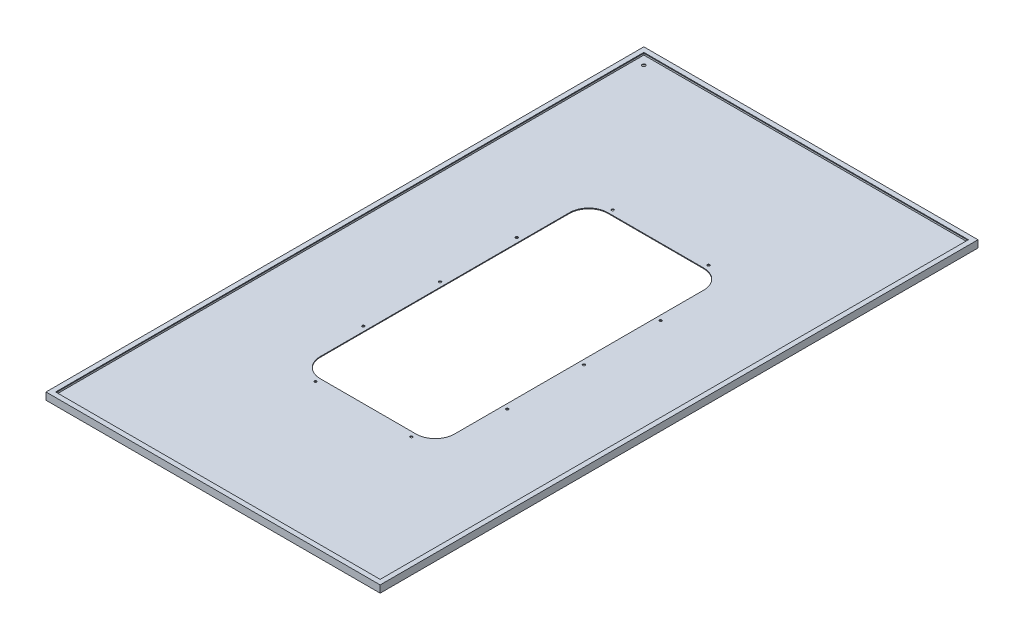
ISO-10303-21;
HEADER;
FILE_DESCRIPTION(('STEP AP214'),'2;1');
FILE_NAME('part.step','',(''),(''),'','','');
FILE_SCHEMA(('AUTOMOTIVE_DESIGN { 1 0 10303 214 1 1 1 1 }'));
ENDSEC;
DATA;
#1=APPLICATION_CONTEXT('core data for automotive mechanical design processes');
#2=APPLICATION_PROTOCOL_DEFINITION('international standard','automotive_design',2000,#1);
#3=PRODUCT_CONTEXT('',#1,'mechanical');
#4=PRODUCT('Part','Part','',(#3));
#5=PRODUCT_RELATED_PRODUCT_CATEGORY('part','',(#4));
#6=PRODUCT_DEFINITION_FORMATION('','',#4);
#7=PRODUCT_DEFINITION_CONTEXT('part definition',#1,'design');
#8=PRODUCT_DEFINITION('design','',#6,#7);
#9=PRODUCT_DEFINITION_SHAPE('','',#8);
#10=(LENGTH_UNIT() NAMED_UNIT(*) SI_UNIT(.MILLI.,.METRE.));
#11=(NAMED_UNIT(*) PLANE_ANGLE_UNIT() SI_UNIT($,.RADIAN.));
#12=(NAMED_UNIT(*) SI_UNIT($,.STERADIAN.) SOLID_ANGLE_UNIT());
#13=UNCERTAINTY_MEASURE_WITH_UNIT(LENGTH_MEASURE(1.E-05),#10,'distance_accuracy_value','');
#14=(GEOMETRIC_REPRESENTATION_CONTEXT(3) GLOBAL_UNCERTAINTY_ASSIGNED_CONTEXT((#13)) GLOBAL_UNIT_ASSIGNED_CONTEXT((#10,
#11,#12)) REPRESENTATION_CONTEXT('',''));
#15=CARTESIAN_POINT('',(0.,0.,0.));
#16=DIRECTION('',(0.,0.,1.));
#17=DIRECTION('',(1.,0.,0.));
#18=AXIS2_PLACEMENT_3D('',#15,#16,#17);
#19=CARTESIAN_POINT('',(-348.5,-485.,701.5));
#20=DIRECTION('',(-1.,0.,0.));
#21=DIRECTION('',(0.,0.,1.));
#22=AXIS2_PLACEMENT_3D('',#19,#20,#21);
#23=PLANE('',#22);
#24=DIRECTION('',(0.,-1.,0.));
#25=VECTOR('',#24,1.);
#26=CARTESIAN_POINT('',(-348.5,-485.,701.5));
#27=LINE('',#26,#25);
#28=CARTESIAN_POINT('',(-348.5,-485.,701.5));
#29=VERTEX_POINT('',#28);
#30=CARTESIAN_POINT('',(-348.5,-500.,701.5));
#31=VERTEX_POINT('',#30);
#32=EDGE_CURVE('E313',#29,#31,#27,.T.);
#33=ORIENTED_EDGE('',*,*,#32,.T.);
#34=DIRECTION('',(0.,0.,-1.));
#35=VECTOR('',#34,1.);
#36=CARTESIAN_POINT('',(-348.5,-500.,701.5));
#37=LINE('',#36,#35);
#38=CARTESIAN_POINT('',(-348.5,-500.,1948.5));
#39=VERTEX_POINT('',#38);
#40=EDGE_CURVE('E299',#39,#31,#37,.T.);
#41=ORIENTED_EDGE('',*,*,#40,.F.);
#42=DIRECTION('',(0.,-1.,0.));
#43=VECTOR('',#42,1.);
#44=CARTESIAN_POINT('',(-348.5,-485.,1948.5));
#45=LINE('',#44,#43);
#46=CARTESIAN_POINT('',(-348.5,-485.,1948.5));
#47=VERTEX_POINT('',#46);
#48=EDGE_CURVE('E25',#47,#39,#45,.T.);
#49=ORIENTED_EDGE('',*,*,#48,.F.);
#50=DIRECTION('',(0.,0.,-1.));
#51=VECTOR('',#50,1.);
#52=CARTESIAN_POINT('',(-348.5,-485.,701.5));
#53=LINE('',#52,#51);
#54=EDGE_CURVE('E300',#47,#29,#53,.T.);
#55=ORIENTED_EDGE('',*,*,#54,.T.);
#56=EDGE_LOOP('',(#33,#41,#49,#55));
#57=FACE_BOUND('',#56,.T.);
#58=ADVANCED_FACE('F17',(#57),#23,.T.);
#59=CARTESIAN_POINT('',(-348.5,-485.,1948.5));
#60=DIRECTION('',(0.,0.,1.));
#61=DIRECTION('',(1.,0.,0.));
#62=AXIS2_PLACEMENT_3D('',#59,#60,#61);
#63=PLANE('',#62);
#64=ORIENTED_EDGE('',*,*,#48,.T.);
#65=DIRECTION('',(-1.,0.,0.));
#66=VECTOR('',#65,1.);
#67=CARTESIAN_POINT('',(-348.5,-500.,1948.5));
#68=LINE('',#67,#66);
#69=CARTESIAN_POINT('',(348.5,-500.,1948.5));
#70=VERTEX_POINT('',#69);
#71=EDGE_CURVE('E304',#70,#39,#68,.T.);
#72=ORIENTED_EDGE('',*,*,#71,.F.);
#73=DIRECTION('',(0.,-1.,0.));
#74=VECTOR('',#73,1.);
#75=CARTESIAN_POINT('',(348.5,-485.,1948.5));
#76=LINE('',#75,#74);
#77=CARTESIAN_POINT('',(348.5,-485.,1948.5));
#78=VERTEX_POINT('',#77);
#79=EDGE_CURVE('E325',#78,#70,#76,.T.);
#80=ORIENTED_EDGE('',*,*,#79,.F.);
#81=DIRECTION('',(-1.,0.,0.));
#82=VECTOR('',#81,1.);
#83=CARTESIAN_POINT('',(-348.5,-485.,1948.5));
#84=LINE('',#83,#82);
#85=EDGE_CURVE('E310',#78,#47,#84,.T.);
#86=ORIENTED_EDGE('',*,*,#85,.T.);
#87=EDGE_LOOP('',(#64,#72,#80,#86));
#88=FACE_BOUND('',#87,.T.);
#89=ADVANCED_FACE('F388',(#88),#63,.T.);
#90=CARTESIAN_POINT('',(348.5,-485.,701.5));
#91=DIRECTION('',(1.,0.,0.));
#92=DIRECTION('',(0.,0.,-1.));
#93=AXIS2_PLACEMENT_3D('',#90,#91,#92);
#94=PLANE('',#93);
#95=ORIENTED_EDGE('',*,*,#79,.T.);
#96=DIRECTION('',(0.,0.,1.));
#97=VECTOR('',#96,1.);
#98=CARTESIAN_POINT('',(348.5,-500.,701.5));
#99=LINE('',#98,#97);
#100=CARTESIAN_POINT('',(348.5,-500.,701.5));
#101=VERTEX_POINT('',#100);
#102=EDGE_CURVE('E319',#101,#70,#99,.T.);
#103=ORIENTED_EDGE('',*,*,#102,.F.);
#104=DIRECTION('',(0.,-1.,0.));
#105=VECTOR('',#104,1.);
#106=CARTESIAN_POINT('',(348.5,-485.,701.5));
#107=LINE('',#106,#105);
#108=CARTESIAN_POINT('',(348.5,-485.,701.5));
#109=VERTEX_POINT('',#108);
#110=EDGE_CURVE('E327',#109,#101,#107,.T.);
#111=ORIENTED_EDGE('',*,*,#110,.F.);
#112=DIRECTION('',(0.,0.,1.));
#113=VECTOR('',#112,1.);
#114=CARTESIAN_POINT('',(348.5,-485.,701.5));
#115=LINE('',#114,#113);
#116=EDGE_CURVE('E307',#109,#78,#115,.T.);
#117=ORIENTED_EDGE('',*,*,#116,.T.);
#118=EDGE_LOOP('',(#95,#103,#111,#117));
#119=FACE_BOUND('',#118,.T.);
#120=ADVANCED_FACE('F393',(#119),#94,.T.);
#121=CARTESIAN_POINT('',(-348.5,-485.,701.5));
#122=DIRECTION('',(0.,0.,-1.));
#123=DIRECTION('',(-1.,0.,0.));
#124=AXIS2_PLACEMENT_3D('',#121,#122,#123);
#125=PLANE('',#124);
#126=ORIENTED_EDGE('',*,*,#110,.T.);
#127=DIRECTION('',(1.,0.,0.));
#128=VECTOR('',#127,1.);
#129=CARTESIAN_POINT('',(-348.5,-500.,701.5));
#130=LINE('',#129,#128);
#131=EDGE_CURVE('E316',#31,#101,#130,.T.);
#132=ORIENTED_EDGE('',*,*,#131,.F.);
#133=ORIENTED_EDGE('',*,*,#32,.F.);
#134=DIRECTION('',(1.,0.,0.));
#135=VECTOR('',#134,1.);
#136=CARTESIAN_POINT('',(-348.5,-485.,701.5));
#137=LINE('',#136,#135);
#138=EDGE_CURVE('E303',#29,#109,#137,.T.);
#139=ORIENTED_EDGE('',*,*,#138,.T.);
#140=EDGE_LOOP('',(#126,#132,#133,#139));
#141=FACE_BOUND('',#140,.T.);
#142=ADVANCED_FACE('F401',(#141),#125,.T.);
#143=CARTESIAN_POINT('',(0.,-485.,0.));
#144=DIRECTION('',(0.,1.,0.));
#145=DIRECTION('',(0.,0.,1.));
#146=AXIS2_PLACEMENT_3D('',#143,#144,#145);
#147=PLANE('',#146);
#148=ORIENTED_EDGE('',*,*,#138,.F.);
#149=ORIENTED_EDGE('',*,*,#54,.F.);
#150=ORIENTED_EDGE('',*,*,#85,.F.);
#151=ORIENTED_EDGE('',*,*,#116,.F.);
#152=EDGE_LOOP('',(#148,#149,#150,#151));
#153=FACE_BOUND('',#152,.T.);
#154=DIRECTION('',(0.,0.,-1.));
#155=VECTOR('',#154,1.);
#156=CARTESIAN_POINT('',(338.5,-485.,1938.5));
#157=LINE('',#156,#155);
#158=CARTESIAN_POINT('',(338.5,-485.,1938.5));
#159=VERTEX_POINT('',#158);
#160=CARTESIAN_POINT('',(338.5,-485.,711.5));
#161=VERTEX_POINT('',#160);
#162=EDGE_CURVE('E252',#159,#161,#157,.T.);
#163=ORIENTED_EDGE('',*,*,#162,.F.);
#164=DIRECTION('',(1.,0.,0.));
#165=VECTOR('',#164,1.);
#166=CARTESIAN_POINT('',(-338.5,-485.,1938.5));
#167=LINE('',#166,#165);
#168=CARTESIAN_POINT('',(-338.5,-485.,1938.5));
#169=VERTEX_POINT('',#168);
#170=EDGE_CURVE('E242',#169,#159,#167,.T.);
#171=ORIENTED_EDGE('',*,*,#170,.F.);
#172=DIRECTION('',(0.,0.,1.));
#173=VECTOR('',#172,1.);
#174=CARTESIAN_POINT('',(-338.5,-485.,711.5));
#175=LINE('',#174,#173);
#176=CARTESIAN_POINT('',(-338.5,-485.,711.5));
#177=VERTEX_POINT('',#176);
#178=EDGE_CURVE('E257',#177,#169,#175,.T.);
#179=ORIENTED_EDGE('',*,*,#178,.F.);
#180=DIRECTION('',(-1.,0.,0.));
#181=VECTOR('',#180,1.);
#182=CARTESIAN_POINT('',(338.5,-485.,711.5));
#183=LINE('',#182,#181);
#184=EDGE_CURVE('E254',#161,#177,#183,.T.);
#185=ORIENTED_EDGE('',*,*,#184,.F.);
#186=EDGE_LOOP('',(#163,#171,#179,#185));
#187=FACE_BOUND('',#186,.T.);
#188=ADVANCED_FACE('F384',(#153,#187),#147,.T.);
#189=CARTESIAN_POINT('',(0.,-500.,0.));
#190=DIRECTION('',(0.,1.,0.));
#191=DIRECTION('',(0.,0.,1.));
#192=AXIS2_PLACEMENT_3D('',#189,#190,#191);
#193=PLANE('',#192);
#194=CARTESIAN_POINT('',(-150.,-500.,1165.));
#195=DIRECTION('',(0.,1.,0.));
#196=DIRECTION('',(0.,0.,1.));
#197=AXIS2_PLACEMENT_3D('',#194,#195,#196);
#198=CIRCLE('',#197,2.49999999999988);
#199=CARTESIAN_POINT('',(-150.,-500.,1167.5));
#200=VERTEX_POINT('',#199);
#201=EDGE_CURVE('E758',#200,#200,#198,.T.);
#202=ORIENTED_EDGE('',*,*,#201,.T.);
#203=EDGE_LOOP('',(#202));
#204=FACE_BOUND('',#203,.T.);
#205=CARTESIAN_POINT('',(-100.,-500.,1015.));
#206=DIRECTION('',(0.,1.,0.));
#207=DIRECTION('',(0.,0.,1.));
#208=AXIS2_PLACEMENT_3D('',#205,#206,#207);
#209=CIRCLE('',#208,2.49999999999988);
#210=CARTESIAN_POINT('',(-100.,-500.,1017.5));
#211=VERTEX_POINT('',#210);
#212=EDGE_CURVE('E759',#211,#211,#209,.T.);
#213=ORIENTED_EDGE('',*,*,#212,.T.);
#214=EDGE_LOOP('',(#213));
#215=FACE_BOUND('',#214,.T.);
#216=CARTESIAN_POINT('',(150.,-500.,1165.));
#217=DIRECTION('',(0.,1.,0.));
#218=DIRECTION('',(0.,0.,1.));
#219=AXIS2_PLACEMENT_3D('',#216,#217,#218);
#220=CIRCLE('',#219,2.49999999999988);
#221=CARTESIAN_POINT('',(150.,-500.,1167.5));
#222=VERTEX_POINT('',#221);
#223=EDGE_CURVE('E762',#222,#222,#220,.T.);
#224=ORIENTED_EDGE('',*,*,#223,.T.);
#225=EDGE_LOOP('',(#224));
#226=FACE_BOUND('',#225,.T.);
#227=CARTESIAN_POINT('',(100.,-500.,1015.));
#228=DIRECTION('',(0.,1.,0.));
#229=DIRECTION('',(0.,0.,1.));
#230=AXIS2_PLACEMENT_3D('',#227,#228,#229);
#231=CIRCLE('',#230,2.49999999999988);
#232=CARTESIAN_POINT('',(100.,-500.,1017.5));
#233=VERTEX_POINT('',#232);
#234=EDGE_CURVE('E767',#233,#233,#231,.T.);
#235=ORIENTED_EDGE('',*,*,#234,.T.);
#236=EDGE_LOOP('',(#235));
#237=FACE_BOUND('',#236,.T.);
#238=CARTESIAN_POINT('',(100.,-500.,1635.));
#239=DIRECTION('',(0.,1.,0.));
#240=DIRECTION('',(0.,0.,1.));
#241=AXIS2_PLACEMENT_3D('',#238,#239,#240);
#242=CIRCLE('',#241,2.49999999999988);
#243=CARTESIAN_POINT('',(100.,-500.,1637.5));
#244=VERTEX_POINT('',#243);
#245=EDGE_CURVE('E770',#244,#244,#242,.T.);
#246=ORIENTED_EDGE('',*,*,#245,.T.);
#247=EDGE_LOOP('',(#246));
#248=FACE_BOUND('',#247,.T.);
#249=CARTESIAN_POINT('',(150.,-500.,1485.));
#250=DIRECTION('',(0.,1.,0.));
#251=DIRECTION('',(0.,0.,1.));
#252=AXIS2_PLACEMENT_3D('',#249,#250,#251);
#253=CIRCLE('',#252,2.49999999999988);
#254=CARTESIAN_POINT('',(150.,-500.,1487.5));
#255=VERTEX_POINT('',#254);
#256=EDGE_CURVE('E773',#255,#255,#253,.T.);
#257=ORIENTED_EDGE('',*,*,#256,.T.);
#258=EDGE_LOOP('',(#257));
#259=FACE_BOUND('',#258,.T.);
#260=CARTESIAN_POINT('',(-100.,-500.,1635.));
#261=DIRECTION('',(0.,1.,0.));
#262=DIRECTION('',(0.,0.,1.));
#263=AXIS2_PLACEMENT_3D('',#260,#261,#262);
#264=CIRCLE('',#263,2.49999999999988);
#265=CARTESIAN_POINT('',(-100.,-500.,1637.5));
#266=VERTEX_POINT('',#265);
#267=EDGE_CURVE('E776',#266,#266,#264,.T.);
#268=ORIENTED_EDGE('',*,*,#267,.T.);
#269=EDGE_LOOP('',(#268));
#270=FACE_BOUND('',#269,.T.);
#271=CARTESIAN_POINT('',(-150.,-500.,1485.));
#272=DIRECTION('',(0.,1.,0.));
#273=DIRECTION('',(0.,0.,1.));
#274=AXIS2_PLACEMENT_3D('',#271,#272,#273);
#275=CIRCLE('',#274,2.49999999999988);
#276=CARTESIAN_POINT('',(-150.,-500.,1487.5));
#277=VERTEX_POINT('',#276);
#278=EDGE_CURVE('E779',#277,#277,#275,.T.);
#279=ORIENTED_EDGE('',*,*,#278,.T.);
#280=EDGE_LOOP('',(#279));
#281=FACE_BOUND('',#280,.T.);
#282=CARTESIAN_POINT('',(150.,-500.,1325.));
#283=DIRECTION('',(0.,1.,0.));
#284=DIRECTION('',(0.,0.,1.));
#285=AXIS2_PLACEMENT_3D('',#282,#283,#284);
#286=CIRCLE('',#285,2.49999999999994);
#287=CARTESIAN_POINT('',(150.,-500.,1327.5));
#288=VERTEX_POINT('',#287);
#289=EDGE_CURVE('E782',#288,#288,#286,.T.);
#290=ORIENTED_EDGE('',*,*,#289,.T.);
#291=EDGE_LOOP('',(#290));
#292=FACE_BOUND('',#291,.T.);
#293=CARTESIAN_POINT('',(-150.,-500.,1325.));
#294=DIRECTION('',(0.,1.,0.));
#295=DIRECTION('',(0.,0.,1.));
#296=AXIS2_PLACEMENT_3D('',#293,#294,#295);
#297=CIRCLE('',#296,2.49999999999994);
#298=CARTESIAN_POINT('',(-150.,-500.,1327.5));
#299=VERTEX_POINT('',#298);
#300=EDGE_CURVE('E785',#299,#299,#297,.T.);
#301=ORIENTED_EDGE('',*,*,#300,.T.);
#302=EDGE_LOOP('',(#301));
#303=FACE_BOUND('',#302,.T.);
#304=DIRECTION('',(1.,0.,0.));
#305=VECTOR('',#304,1.);
#306=CARTESIAN_POINT('',(0.,-500.,1625.));
#307=LINE('',#306,#305);
#308=CARTESIAN_POINT('',(-99.9999999999997,-500.,1625.));
#309=VERTEX_POINT('',#308);
#310=CARTESIAN_POINT('',(99.9999999999998,-500.,1625.));
#311=VERTEX_POINT('',#310);
#312=EDGE_CURVE('E219',#309,#311,#307,.T.);
#313=ORIENTED_EDGE('',*,*,#312,.T.);
#314=CARTESIAN_POINT('',(100.,-500.,1585.));
#315=DIRECTION('',(0.,1.,0.));
#316=DIRECTION('',(0.,0.,1.));
#317=AXIS2_PLACEMENT_3D('',#314,#315,#316);
#318=CIRCLE('',#317,40.);
#319=CARTESIAN_POINT('',(140.,-500.,1585.));
#320=VERTEX_POINT('',#319);
#321=EDGE_CURVE('E222',#311,#320,#318,.T.);
#322=ORIENTED_EDGE('',*,*,#321,.T.);
#323=DIRECTION('',(0.,0.,-1.));
#324=VECTOR('',#323,1.);
#325=CARTESIAN_POINT('',(140.,-500.,0.));
#326=LINE('',#325,#324);
#327=CARTESIAN_POINT('',(140.,-500.,1065.));
#328=VERTEX_POINT('',#327);
#329=EDGE_CURVE('E194',#320,#328,#326,.T.);
#330=ORIENTED_EDGE('',*,*,#329,.T.);
#331=CARTESIAN_POINT('',(100.,-500.,1065.));
#332=DIRECTION('',(0.,1.,0.));
#333=DIRECTION('',(0.,0.,1.));
#334=AXIS2_PLACEMENT_3D('',#331,#332,#333);
#335=CIRCLE('',#334,40.);
#336=CARTESIAN_POINT('',(99.9999999999998,-500.,1025.));
#337=VERTEX_POINT('',#336);
#338=EDGE_CURVE('E161',#328,#337,#335,.T.);
#339=ORIENTED_EDGE('',*,*,#338,.T.);
#340=DIRECTION('',(-1.,0.,0.));
#341=VECTOR('',#340,1.);
#342=CARTESIAN_POINT('',(0.,-500.,1025.));
#343=LINE('',#342,#341);
#344=CARTESIAN_POINT('',(-100.,-500.,1025.));
#345=VERTEX_POINT('',#344);
#346=EDGE_CURVE('E207',#337,#345,#343,.T.);
#347=ORIENTED_EDGE('',*,*,#346,.T.);
#348=CARTESIAN_POINT('',(-100.,-500.,1065.));
#349=DIRECTION('',(0.,1.,0.));
#350=DIRECTION('',(0.,0.,1.));
#351=AXIS2_PLACEMENT_3D('',#348,#349,#350);
#352=CIRCLE('',#351,40.);
#353=CARTESIAN_POINT('',(-140.,-500.,1065.));
#354=VERTEX_POINT('',#353);
#355=EDGE_CURVE('E210',#345,#354,#352,.T.);
#356=ORIENTED_EDGE('',*,*,#355,.T.);
#357=DIRECTION('',(0.,0.,1.));
#358=VECTOR('',#357,1.);
#359=CARTESIAN_POINT('',(-140.,-500.,0.));
#360=LINE('',#359,#358);
#361=CARTESIAN_POINT('',(-140.,-500.,1585.));
#362=VERTEX_POINT('',#361);
#363=EDGE_CURVE('E213',#354,#362,#360,.T.);
#364=ORIENTED_EDGE('',*,*,#363,.T.);
#365=CARTESIAN_POINT('',(-100.,-500.,1585.));
#366=DIRECTION('',(0.,1.,0.));
#367=DIRECTION('',(0.,0.,1.));
#368=AXIS2_PLACEMENT_3D('',#365,#366,#367);
#369=CIRCLE('',#368,40.);
#370=EDGE_CURVE('E216',#362,#309,#369,.T.);
#371=ORIENTED_EDGE('',*,*,#370,.T.);
#372=EDGE_LOOP('',(#313,#322,#330,#339,#347,#356,#364,#371));
#373=FACE_BOUND('',#372,.T.);
#374=CARTESIAN_POINT('',(-328.5,-500.,1928.5));
#375=DIRECTION('',(0.,-1.,0.));
#376=DIRECTION('',(0.,0.,-1.));
#377=AXIS2_PLACEMENT_3D('',#374,#375,#376);
#378=CIRCLE('',#377,3.5);
#379=CARTESIAN_POINT('',(-328.5,-500.,1925.));
#380=VERTEX_POINT('',#379);
#381=EDGE_CURVE('E229',#380,#380,#378,.T.);
#382=ORIENTED_EDGE('',*,*,#381,.F.);
#383=EDGE_LOOP('',(#382));
#384=FACE_BOUND('',#383,.T.);
#385=CARTESIAN_POINT('',(328.5,-500.,721.500000000001));
#386=DIRECTION('',(0.,-1.,0.));
#387=DIRECTION('',(0.,0.,-1.));
#388=AXIS2_PLACEMENT_3D('',#385,#386,#387);
#389=CIRCLE('',#388,3.5);
#390=CARTESIAN_POINT('',(328.5,-500.,718.000000000001));
#391=VERTEX_POINT('',#390);
#392=EDGE_CURVE('E228',#391,#391,#389,.T.);
#393=ORIENTED_EDGE('',*,*,#392,.F.);
#394=EDGE_LOOP('',(#393));
#395=FACE_BOUND('',#394,.T.);
#396=CARTESIAN_POINT('',(328.5,-500.,1928.5));
#397=DIRECTION('',(0.,-1.,0.));
#398=DIRECTION('',(0.,0.,-1.));
#399=AXIS2_PLACEMENT_3D('',#396,#397,#398);
#400=CIRCLE('',#399,3.5);
#401=CARTESIAN_POINT('',(328.5,-500.,1925.));
#402=VERTEX_POINT('',#401);
#403=EDGE_CURVE('E225',#402,#402,#400,.T.);
#404=ORIENTED_EDGE('',*,*,#403,.F.);
#405=EDGE_LOOP('',(#404));
#406=FACE_BOUND('',#405,.T.);
#407=CARTESIAN_POINT('',(-328.5,-500.,721.5));
#408=DIRECTION('',(0.,-1.,0.));
#409=DIRECTION('',(0.,0.,-1.));
#410=AXIS2_PLACEMENT_3D('',#407,#408,#409);
#411=CIRCLE('',#410,3.5);
#412=CARTESIAN_POINT('',(-328.5,-500.,718.));
#413=VERTEX_POINT('',#412);
#414=EDGE_CURVE('E232',#413,#413,#411,.T.);
#415=ORIENTED_EDGE('',*,*,#414,.F.);
#416=EDGE_LOOP('',(#415));
#417=FACE_BOUND('',#416,.T.);
#418=ORIENTED_EDGE('',*,*,#40,.T.);
#419=ORIENTED_EDGE('',*,*,#131,.T.);
#420=ORIENTED_EDGE('',*,*,#102,.T.);
#421=ORIENTED_EDGE('',*,*,#71,.T.);
#422=EDGE_LOOP('',(#418,#419,#420,#421));
#423=FACE_BOUND('',#422,.T.);
#424=ADVANCED_FACE('F373',(#204,#215,#226,#237,#248,#259,#270,#281,#292,#303,#373,#384,#395,
#406,#417,#423),#193,.F.);
#425=CARTESIAN_POINT('',(0.,-486.5,0.));
#426=DIRECTION('',(0.,1.,0.));
#427=DIRECTION('',(0.,0.,1.));
#428=AXIS2_PLACEMENT_3D('',#425,#426,#427);
#429=PLANE('',#428);
#430=DIRECTION('',(1.,0.,0.));
#431=VECTOR('',#430,1.);
#432=CARTESIAN_POINT('',(-338.5,-486.5,1938.5));
#433=LINE('',#432,#431);
#434=CARTESIAN_POINT('',(-338.5,-486.5,1938.5));
#435=VERTEX_POINT('',#434);
#436=CARTESIAN_POINT('',(338.5,-486.5,1938.5));
#437=VERTEX_POINT('',#436);
#438=EDGE_CURVE('E248',#435,#437,#433,.T.);
#439=ORIENTED_EDGE('',*,*,#438,.T.);
#440=DIRECTION('',(0.,0.,-1.));
#441=VECTOR('',#440,1.);
#442=CARTESIAN_POINT('',(338.5,-486.5,1938.5));
#443=LINE('',#442,#441);
#444=CARTESIAN_POINT('',(338.5,-486.5,711.5));
#445=VERTEX_POINT('',#444);
#446=EDGE_CURVE('E238',#437,#445,#443,.T.);
#447=ORIENTED_EDGE('',*,*,#446,.T.);
#448=DIRECTION('',(-1.,0.,0.));
#449=VECTOR('',#448,1.);
#450=CARTESIAN_POINT('',(338.5,-486.5,711.5));
#451=LINE('',#450,#449);
#452=CARTESIAN_POINT('',(-338.5,-486.5,711.5));
#453=VERTEX_POINT('',#452);
#454=EDGE_CURVE('E241',#445,#453,#451,.T.);
#455=ORIENTED_EDGE('',*,*,#454,.T.);
#456=DIRECTION('',(0.,0.,1.));
#457=VECTOR('',#456,1.);
#458=CARTESIAN_POINT('',(-338.5,-486.5,711.5));
#459=LINE('',#458,#457);
#460=EDGE_CURVE('E245',#453,#435,#459,.T.);
#461=ORIENTED_EDGE('',*,*,#460,.T.);
#462=EDGE_LOOP('',(#439,#447,#455,#461));
#463=FACE_BOUND('',#462,.T.);
#464=DIRECTION('',(0.,0.,-1.));
#465=VECTOR('',#464,1.);
#466=CARTESIAN_POINT('',(-347.,-486.5,703.));
#467=LINE('',#466,#465);
#468=CARTESIAN_POINT('',(-347.,-486.5,1947.));
#469=VERTEX_POINT('',#468);
#470=CARTESIAN_POINT('',(-347.,-486.5,703.));
#471=VERTEX_POINT('',#470);
#472=EDGE_CURVE('E11',#469,#471,#467,.T.);
#473=ORIENTED_EDGE('',*,*,#472,.T.);
#474=DIRECTION('',(1.,0.,0.));
#475=VECTOR('',#474,1.);
#476=CARTESIAN_POINT('',(347.,-486.5,703.));
#477=LINE('',#476,#475);
#478=CARTESIAN_POINT('',(347.,-486.5,703.));
#479=VERTEX_POINT('',#478);
#480=EDGE_CURVE('E276',#471,#479,#477,.T.);
#481=ORIENTED_EDGE('',*,*,#480,.T.);
#482=DIRECTION('',(0.,0.,1.));
#483=VECTOR('',#482,1.);
#484=CARTESIAN_POINT('',(347.,-486.5,1947.));
#485=LINE('',#484,#483);
#486=CARTESIAN_POINT('',(347.,-486.5,1947.));
#487=VERTEX_POINT('',#486);
#488=EDGE_CURVE('E273',#479,#487,#485,.T.);
#489=ORIENTED_EDGE('',*,*,#488,.T.);
#490=DIRECTION('',(-1.,0.,0.));
#491=VECTOR('',#490,1.);
#492=CARTESIAN_POINT('',(-347.,-486.5,1947.));
#493=LINE('',#492,#491);
#494=EDGE_CURVE('E264',#487,#469,#493,.T.);
#495=ORIENTED_EDGE('',*,*,#494,.T.);
#496=EDGE_LOOP('',(#473,#481,#489,#495));
#497=FACE_BOUND('',#496,.T.);
#498=ADVANCED_FACE('F370',(#463,#497),#429,.F.);
#499=CARTESIAN_POINT('',(338.5,-486.5,1938.5));
#500=DIRECTION('',(1.,0.,0.));
#501=DIRECTION('',(0.,0.,-1.));
#502=AXIS2_PLACEMENT_3D('',#499,#500,#501);
#503=PLANE('',#502);
#504=ORIENTED_EDGE('',*,*,#162,.T.);
#505=DIRECTION('',(0.,1.,0.));
#506=VECTOR('',#505,1.);
#507=CARTESIAN_POINT('',(338.5,-486.5,711.5));
#508=LINE('',#507,#506);
#509=EDGE_CURVE('E251',#445,#161,#508,.T.);
#510=ORIENTED_EDGE('',*,*,#509,.F.);
#511=ORIENTED_EDGE('',*,*,#446,.F.);
#512=DIRECTION('',(0.,1.,0.));
#513=VECTOR('',#512,1.);
#514=CARTESIAN_POINT('',(338.5,-486.5,1938.5));
#515=LINE('',#514,#513);
#516=EDGE_CURVE('E262',#437,#159,#515,.T.);
#517=ORIENTED_EDGE('',*,*,#516,.T.);
#518=EDGE_LOOP('',(#504,#510,#511,#517));
#519=FACE_BOUND('',#518,.T.);
#520=ADVANCED_FACE('F372',(#519),#503,.F.);
#521=CARTESIAN_POINT('',(-338.5,-486.5,1938.5));
#522=DIRECTION('',(0.,0.,1.));
#523=DIRECTION('',(1.,0.,0.));
#524=AXIS2_PLACEMENT_3D('',#521,#522,#523);
#525=PLANE('',#524);
#526=ORIENTED_EDGE('',*,*,#170,.T.);
#527=ORIENTED_EDGE('',*,*,#516,.F.);
#528=ORIENTED_EDGE('',*,*,#438,.F.);
#529=DIRECTION('',(0.,1.,0.));
#530=VECTOR('',#529,1.);
#531=CARTESIAN_POINT('',(-338.5,-486.5,1938.5));
#532=LINE('',#531,#530);
#533=EDGE_CURVE('E265',#435,#169,#532,.T.);
#534=ORIENTED_EDGE('',*,*,#533,.T.);
#535=EDGE_LOOP('',(#526,#527,#528,#534));
#536=FACE_BOUND('',#535,.T.);
#537=ADVANCED_FACE('F381',(#536),#525,.F.);
#538=CARTESIAN_POINT('',(-338.5,-486.5,711.5));
#539=DIRECTION('',(-1.,0.,0.));
#540=DIRECTION('',(0.,0.,1.));
#541=AXIS2_PLACEMENT_3D('',#538,#539,#540);
#542=PLANE('',#541);
#543=ORIENTED_EDGE('',*,*,#178,.T.);
#544=ORIENTED_EDGE('',*,*,#533,.F.);
#545=ORIENTED_EDGE('',*,*,#460,.F.);
#546=DIRECTION('',(0.,1.,0.));
#547=VECTOR('',#546,1.);
#548=CARTESIAN_POINT('',(-338.5,-486.5,711.5));
#549=LINE('',#548,#547);
#550=EDGE_CURVE('E267',#453,#177,#549,.T.);
#551=ORIENTED_EDGE('',*,*,#550,.T.);
#552=EDGE_LOOP('',(#543,#544,#545,#551));
#553=FACE_BOUND('',#552,.T.);
#554=ADVANCED_FACE('F641',(#553),#542,.F.);
#555=CARTESIAN_POINT('',(338.5,-486.5,711.5));
#556=DIRECTION('',(0.,0.,-1.));
#557=DIRECTION('',(-1.,0.,0.));
#558=AXIS2_PLACEMENT_3D('',#555,#556,#557);
#559=PLANE('',#558);
#560=ORIENTED_EDGE('',*,*,#184,.T.);
#561=ORIENTED_EDGE('',*,*,#550,.F.);
#562=ORIENTED_EDGE('',*,*,#454,.F.);
#563=ORIENTED_EDGE('',*,*,#509,.T.);
#564=EDGE_LOOP('',(#560,#561,#562,#563));
#565=FACE_BOUND('',#564,.T.);
#566=ADVANCED_FACE('F346',(#565),#559,.F.);
#567=CARTESIAN_POINT('',(0.,-498.5,0.));
#568=DIRECTION('',(0.,1.,0.));
#569=DIRECTION('',(0.,0.,1.));
#570=AXIS2_PLACEMENT_3D('',#567,#568,#569);
#571=PLANE('',#570);
#572=CARTESIAN_POINT('',(-150.,-498.5,1165.));
#573=DIRECTION('',(0.,1.,0.));
#574=DIRECTION('',(0.,0.,1.));
#575=AXIS2_PLACEMENT_3D('',#572,#573,#574);
#576=CIRCLE('',#575,2.49999999999988);
#577=CARTESIAN_POINT('',(-150.,-498.5,1167.5));
#578=VERTEX_POINT('',#577);
#579=EDGE_CURVE('E755',#578,#578,#576,.T.);
#580=ORIENTED_EDGE('',*,*,#579,.F.);
#581=EDGE_LOOP('',(#580));
#582=FACE_BOUND('',#581,.T.);
#583=CARTESIAN_POINT('',(-100.,-498.5,1015.));
#584=DIRECTION('',(0.,1.,0.));
#585=DIRECTION('',(0.,0.,1.));
#586=AXIS2_PLACEMENT_3D('',#583,#584,#585);
#587=CIRCLE('',#586,2.49999999999988);
#588=CARTESIAN_POINT('',(-100.,-498.5,1017.5));
#589=VERTEX_POINT('',#588);
#590=EDGE_CURVE('E810',#589,#589,#587,.T.);
#591=ORIENTED_EDGE('',*,*,#590,.F.);
#592=EDGE_LOOP('',(#591));
#593=FACE_BOUND('',#592,.T.);
#594=CARTESIAN_POINT('',(150.,-498.5,1165.));
#595=DIRECTION('',(0.,1.,0.));
#596=DIRECTION('',(0.,0.,-1.));
#597=AXIS2_PLACEMENT_3D('',#594,#595,#596);
#598=CIRCLE('',#597,2.49999999999988);
#599=CARTESIAN_POINT('',(150.,-498.5,1162.5));
#600=VERTEX_POINT('',#599);
#601=EDGE_CURVE('E807',#600,#600,#598,.T.);
#602=ORIENTED_EDGE('',*,*,#601,.F.);
#603=EDGE_LOOP('',(#602));
#604=FACE_BOUND('',#603,.T.);
#605=CARTESIAN_POINT('',(100.,-498.5,1015.));
#606=DIRECTION('',(0.,1.,0.));
#607=DIRECTION('',(0.,0.,-1.));
#608=AXIS2_PLACEMENT_3D('',#605,#606,#607);
#609=CIRCLE('',#608,2.49999999999988);
#610=CARTESIAN_POINT('',(100.,-498.5,1012.5));
#611=VERTEX_POINT('',#610);
#612=EDGE_CURVE('E804',#611,#611,#609,.T.);
#613=ORIENTED_EDGE('',*,*,#612,.F.);
#614=EDGE_LOOP('',(#613));
#615=FACE_BOUND('',#614,.T.);
#616=CARTESIAN_POINT('',(100.,-498.5,1635.));
#617=DIRECTION('',(0.,1.,0.));
#618=DIRECTION('',(0.,0.,1.));
#619=AXIS2_PLACEMENT_3D('',#616,#617,#618);
#620=CIRCLE('',#619,2.49999999999988);
#621=CARTESIAN_POINT('',(100.,-498.5,1637.5));
#622=VERTEX_POINT('',#621);
#623=EDGE_CURVE('E801',#622,#622,#620,.T.);
#624=ORIENTED_EDGE('',*,*,#623,.F.);
#625=EDGE_LOOP('',(#624));
#626=FACE_BOUND('',#625,.T.);
#627=CARTESIAN_POINT('',(150.,-498.5,1485.));
#628=DIRECTION('',(0.,1.,0.));
#629=DIRECTION('',(0.,0.,1.));
#630=AXIS2_PLACEMENT_3D('',#627,#628,#629);
#631=CIRCLE('',#630,2.49999999999988);
#632=CARTESIAN_POINT('',(150.,-498.5,1487.5));
#633=VERTEX_POINT('',#632);
#634=EDGE_CURVE('E798',#633,#633,#631,.T.);
#635=ORIENTED_EDGE('',*,*,#634,.F.);
#636=EDGE_LOOP('',(#635));
#637=FACE_BOUND('',#636,.T.);
#638=CARTESIAN_POINT('',(-100.,-498.5,1635.));
#639=DIRECTION('',(0.,1.,0.));
#640=DIRECTION('',(0.,0.,-1.));
#641=AXIS2_PLACEMENT_3D('',#638,#639,#640);
#642=CIRCLE('',#641,2.49999999999988);
#643=CARTESIAN_POINT('',(-100.,-498.5,1632.5));
#644=VERTEX_POINT('',#643);
#645=EDGE_CURVE('E794',#644,#644,#642,.T.);
#646=ORIENTED_EDGE('',*,*,#645,.F.);
#647=EDGE_LOOP('',(#646));
#648=FACE_BOUND('',#647,.T.);
#649=CARTESIAN_POINT('',(-150.,-498.5,1485.));
#650=DIRECTION('',(0.,1.,0.));
#651=DIRECTION('',(0.,0.,-1.));
#652=AXIS2_PLACEMENT_3D('',#649,#650,#651);
#653=CIRCLE('',#652,2.49999999999988);
#654=CARTESIAN_POINT('',(-150.,-498.5,1482.5));
#655=VERTEX_POINT('',#654);
#656=EDGE_CURVE('E791',#655,#655,#653,.T.);
#657=ORIENTED_EDGE('',*,*,#656,.F.);
#658=EDGE_LOOP('',(#657));
#659=FACE_BOUND('',#658,.T.);
#660=CARTESIAN_POINT('',(150.,-498.5,1325.));
#661=DIRECTION('',(0.,1.,0.));
#662=DIRECTION('',(0.,0.,-1.));
#663=AXIS2_PLACEMENT_3D('',#660,#661,#662);
#664=CIRCLE('',#663,2.49999999999994);
#665=CARTESIAN_POINT('',(150.,-498.5,1322.5));
#666=VERTEX_POINT('',#665);
#667=EDGE_CURVE('E795',#666,#666,#664,.T.);
#668=ORIENTED_EDGE('',*,*,#667,.F.);
#669=EDGE_LOOP('',(#668));
#670=FACE_BOUND('',#669,.T.);
#671=CARTESIAN_POINT('',(-150.,-498.5,1325.));
#672=DIRECTION('',(0.,1.,0.));
#673=DIRECTION('',(0.,0.,1.));
#674=AXIS2_PLACEMENT_3D('',#671,#672,#673);
#675=CIRCLE('',#674,2.49999999999994);
#676=CARTESIAN_POINT('',(-150.,-498.5,1327.5));
#677=VERTEX_POINT('',#676);
#678=EDGE_CURVE('E788',#677,#677,#675,.T.);
#679=ORIENTED_EDGE('',*,*,#678,.F.);
#680=EDGE_LOOP('',(#679));
#681=FACE_BOUND('',#680,.T.);
#682=CARTESIAN_POINT('',(100.,-498.5,1585.));
#683=DIRECTION('',(0.,1.,0.));
#684=DIRECTION('',(0.,0.,1.));
#685=AXIS2_PLACEMENT_3D('',#682,#683,#684);
#686=CIRCLE('',#685,40.);
#687=CARTESIAN_POINT('',(99.9999999999998,-498.5,1625.));
#688=VERTEX_POINT('',#687);
#689=CARTESIAN_POINT('',(140.,-498.5,1585.));
#690=VERTEX_POINT('',#689);
#691=EDGE_CURVE('E41',#688,#690,#686,.T.);
#692=ORIENTED_EDGE('',*,*,#691,.F.);
#693=DIRECTION('',(1.,0.,0.));
#694=VECTOR('',#693,1.);
#695=CARTESIAN_POINT('',(-99.9999999999997,-498.5,1625.));
#696=LINE('',#695,#694);
#697=CARTESIAN_POINT('',(-99.9999999999997,-498.5,1625.));
#698=VERTEX_POINT('',#697);
#699=EDGE_CURVE('E189',#698,#688,#696,.T.);
#700=ORIENTED_EDGE('',*,*,#699,.F.);
#701=CARTESIAN_POINT('',(-100.,-498.5,1585.));
#702=DIRECTION('',(0.,1.,0.));
#703=DIRECTION('',(0.,0.,-1.));
#704=AXIS2_PLACEMENT_3D('',#701,#702,#703);
#705=CIRCLE('',#704,40.);
#706=CARTESIAN_POINT('',(-140.,-498.5,1585.));
#707=VERTEX_POINT('',#706);
#708=EDGE_CURVE('E186',#707,#698,#705,.T.);
#709=ORIENTED_EDGE('',*,*,#708,.F.);
#710=DIRECTION('',(0.,0.,1.));
#711=VECTOR('',#710,1.);
#712=CARTESIAN_POINT('',(-140.,-498.5,1585.));
#713=LINE('',#712,#711);
#714=CARTESIAN_POINT('',(-140.,-498.5,1065.));
#715=VERTEX_POINT('',#714);
#716=EDGE_CURVE('E183',#715,#707,#713,.T.);
#717=ORIENTED_EDGE('',*,*,#716,.F.);
#718=CARTESIAN_POINT('',(-100.,-498.5,1065.));
#719=DIRECTION('',(0.,1.,0.));
#720=DIRECTION('',(0.,0.,-1.));
#721=AXIS2_PLACEMENT_3D('',#718,#719,#720);
#722=CIRCLE('',#721,40.);
#723=CARTESIAN_POINT('',(-100.,-498.5,1025.));
#724=VERTEX_POINT('',#723);
#725=EDGE_CURVE('E177',#724,#715,#722,.T.);
#726=ORIENTED_EDGE('',*,*,#725,.F.);
#727=DIRECTION('',(-1.,0.,0.));
#728=VECTOR('',#727,1.);
#729=CARTESIAN_POINT('',(-99.9999999999997,-498.5,1025.));
#730=LINE('',#729,#728);
#731=CARTESIAN_POINT('',(99.9999999999998,-498.5,1025.));
#732=VERTEX_POINT('',#731);
#733=EDGE_CURVE('E175',#732,#724,#730,.T.);
#734=ORIENTED_EDGE('',*,*,#733,.F.);
#735=CARTESIAN_POINT('',(100.,-498.5,1065.));
#736=DIRECTION('',(0.,1.,0.));
#737=DIRECTION('',(0.,0.,-1.));
#738=AXIS2_PLACEMENT_3D('',#735,#736,#737);
#739=CIRCLE('',#738,40.);
#740=CARTESIAN_POINT('',(140.,-498.5,1065.));
#741=VERTEX_POINT('',#740);
#742=EDGE_CURVE('E158',#741,#732,#739,.T.);
#743=ORIENTED_EDGE('',*,*,#742,.F.);
#744=DIRECTION('',(0.,0.,-1.));
#745=VECTOR('',#744,1.);
#746=CARTESIAN_POINT('',(140.,-498.5,1585.));
#747=LINE('',#746,#745);
#748=EDGE_CURVE('E167',#690,#741,#747,.T.);
#749=ORIENTED_EDGE('',*,*,#748,.F.);
#750=EDGE_LOOP('',(#692,#700,#709,#717,#726,#734,#743,#749));
#751=FACE_BOUND('',#750,.T.);
#752=CARTESIAN_POINT('',(-328.5,-498.5,1928.5));
#753=DIRECTION('',(0.,1.,0.));
#754=DIRECTION('',(0.,0.,1.));
#755=AXIS2_PLACEMENT_3D('',#752,#753,#754);
#756=CIRCLE('',#755,3.5);
#757=CARTESIAN_POINT('',(-328.5,-498.5,1932.));
#758=VERTEX_POINT('',#757);
#759=EDGE_CURVE('E20',#758,#758,#756,.T.);
#760=ORIENTED_EDGE('',*,*,#759,.F.);
#761=EDGE_LOOP('',(#760));
#762=FACE_BOUND('',#761,.T.);
#763=CARTESIAN_POINT('',(328.5,-498.5,721.500000000001));
#764=DIRECTION('',(0.,1.,0.));
#765=DIRECTION('',(0.,0.,1.));
#766=AXIS2_PLACEMENT_3D('',#763,#764,#765);
#767=CIRCLE('',#766,3.5);
#768=CARTESIAN_POINT('',(328.5,-498.5,725.000000000001));
#769=VERTEX_POINT('',#768);
#770=EDGE_CURVE('E334',#769,#769,#767,.T.);
#771=ORIENTED_EDGE('',*,*,#770,.F.);
#772=EDGE_LOOP('',(#771));
#773=FACE_BOUND('',#772,.T.);
#774=CARTESIAN_POINT('',(328.5,-498.5,1928.5));
#775=DIRECTION('',(0.,1.,0.));
#776=DIRECTION('',(0.,0.,1.));
#777=AXIS2_PLACEMENT_3D('',#774,#775,#776);
#778=CIRCLE('',#777,3.5);
#779=CARTESIAN_POINT('',(328.5,-498.5,1932.));
#780=VERTEX_POINT('',#779);
#781=EDGE_CURVE('E332',#780,#780,#778,.T.);
#782=ORIENTED_EDGE('',*,*,#781,.F.);
#783=EDGE_LOOP('',(#782));
#784=FACE_BOUND('',#783,.T.);
#785=CARTESIAN_POINT('',(-328.5,-498.5,721.5));
#786=DIRECTION('',(0.,1.,0.));
#787=DIRECTION('',(0.,0.,1.));
#788=AXIS2_PLACEMENT_3D('',#785,#786,#787);
#789=CIRCLE('',#788,3.5);
#790=CARTESIAN_POINT('',(-328.5,-498.5,725.000000000001));
#791=VERTEX_POINT('',#790);
#792=EDGE_CURVE('E237',#791,#791,#789,.T.);
#793=ORIENTED_EDGE('',*,*,#792,.F.);
#794=EDGE_LOOP('',(#793));
#795=FACE_BOUND('',#794,.T.);
#796=DIRECTION('',(0.,0.,1.));
#797=VECTOR('',#796,1.);
#798=CARTESIAN_POINT('',(347.,-498.5,1947.));
#799=LINE('',#798,#797);
#800=CARTESIAN_POINT('',(347.,-498.5,703.));
#801=VERTEX_POINT('',#800);
#802=CARTESIAN_POINT('',(347.,-498.5,1947.));
#803=VERTEX_POINT('',#802);
#804=EDGE_CURVE('E290',#801,#803,#799,.T.);
#805=ORIENTED_EDGE('',*,*,#804,.F.);
#806=DIRECTION('',(1.,0.,0.));
#807=VECTOR('',#806,1.);
#808=CARTESIAN_POINT('',(347.,-498.5,703.));
#809=LINE('',#808,#807);
#810=CARTESIAN_POINT('',(-347.,-498.5,703.));
#811=VERTEX_POINT('',#810);
#812=EDGE_CURVE('E293',#811,#801,#809,.T.);
#813=ORIENTED_EDGE('',*,*,#812,.F.);
#814=DIRECTION('',(0.,0.,-1.));
#815=VECTOR('',#814,1.);
#816=CARTESIAN_POINT('',(-347.,-498.5,703.));
#817=LINE('',#816,#815);
#818=CARTESIAN_POINT('',(-347.,-498.5,1947.));
#819=VERTEX_POINT('',#818);
#820=EDGE_CURVE('E296',#819,#811,#817,.T.);
#821=ORIENTED_EDGE('',*,*,#820,.F.);
#822=DIRECTION('',(-1.,0.,0.));
#823=VECTOR('',#822,1.);
#824=CARTESIAN_POINT('',(-347.,-498.5,1947.));
#825=LINE('',#824,#823);
#826=EDGE_CURVE('E287',#803,#819,#825,.T.);
#827=ORIENTED_EDGE('',*,*,#826,.F.);
#828=EDGE_LOOP('',(#805,#813,#821,#827));
#829=FACE_BOUND('',#828,.T.);
#830=ADVANCED_FACE('F171',(#582,#593,#604,#615,#626,#637,#648,#659,#670,#681,#751,#762,#773,
#784,#795,#829),#571,.T.);
#831=CARTESIAN_POINT('',(-347.,-1924.49008420557,703.));
#832=DIRECTION('',(-1.,0.,0.));
#833=DIRECTION('',(0.,0.,1.));
#834=AXIS2_PLACEMENT_3D('',#831,#832,#833);
#835=PLANE('',#834);
#836=ORIENTED_EDGE('',*,*,#472,.F.);
#837=DIRECTION('',(0.,-1.,0.));
#838=VECTOR('',#837,1.);
#839=CARTESIAN_POINT('',(-347.,943.572014285594,1947.));
#840=LINE('',#839,#838);
#841=EDGE_CURVE('E285',#469,#819,#840,.T.);
#842=ORIENTED_EDGE('',*,*,#841,.T.);
#843=ORIENTED_EDGE('',*,*,#820,.T.);
#844=DIRECTION('',(0.,-1.,0.));
#845=VECTOR('',#844,1.);
#846=CARTESIAN_POINT('',(-347.,943.572014285594,703.));
#847=LINE('',#846,#845);
#848=EDGE_CURVE('E279',#471,#811,#847,.T.);
#849=ORIENTED_EDGE('',*,*,#848,.F.);
#850=EDGE_LOOP('',(#836,#842,#843,#849));
#851=FACE_BOUND('',#850,.T.);
#852=ADVANCED_FACE('F345',(#851),#835,.F.);
#853=CARTESIAN_POINT('',(-347.,-1924.49008420557,1947.));
#854=DIRECTION('',(0.,0.,1.));
#855=DIRECTION('',(0.,-1.,0.));
#856=AXIS2_PLACEMENT_3D('',#853,#854,#855);
#857=PLANE('',#856);
#858=ORIENTED_EDGE('',*,*,#494,.F.);
#859=DIRECTION('',(0.,-1.,0.));
#860=VECTOR('',#859,1.);
#861=CARTESIAN_POINT('',(347.,943.572014285594,1947.));
#862=LINE('',#861,#860);
#863=EDGE_CURVE('E283',#487,#803,#862,.T.);
#864=ORIENTED_EDGE('',*,*,#863,.T.);
#865=ORIENTED_EDGE('',*,*,#826,.T.);
#866=ORIENTED_EDGE('',*,*,#841,.F.);
#867=EDGE_LOOP('',(#858,#864,#865,#866));
#868=FACE_BOUND('',#867,.T.);
#869=ADVANCED_FACE('F367',(#868),#857,.F.);
#870=CARTESIAN_POINT('',(347.,-1924.49008420557,1947.));
#871=DIRECTION('',(1.,0.,0.));
#872=DIRECTION('',(0.,0.,-1.));
#873=AXIS2_PLACEMENT_3D('',#870,#871,#872);
#874=PLANE('',#873);
#875=ORIENTED_EDGE('',*,*,#488,.F.);
#876=DIRECTION('',(0.,-1.,0.));
#877=VECTOR('',#876,1.);
#878=CARTESIAN_POINT('',(347.,943.572014285594,703.));
#879=LINE('',#878,#877);
#880=EDGE_CURVE('E281',#479,#801,#879,.T.);
#881=ORIENTED_EDGE('',*,*,#880,.T.);
#882=ORIENTED_EDGE('',*,*,#804,.T.);
#883=ORIENTED_EDGE('',*,*,#863,.F.);
#884=EDGE_LOOP('',(#875,#881,#882,#883));
#885=FACE_BOUND('',#884,.T.);
#886=ADVANCED_FACE('F368',(#885),#874,.F.);
#887=CARTESIAN_POINT('',(347.,-1924.49008420557,703.));
#888=DIRECTION('',(0.,0.,-1.));
#889=DIRECTION('',(0.,1.,0.));
#890=AXIS2_PLACEMENT_3D('',#887,#888,#889);
#891=PLANE('',#890);
#892=ORIENTED_EDGE('',*,*,#480,.F.);
#893=ORIENTED_EDGE('',*,*,#848,.T.);
#894=ORIENTED_EDGE('',*,*,#812,.T.);
#895=ORIENTED_EDGE('',*,*,#880,.F.);
#896=EDGE_LOOP('',(#892,#893,#894,#895));
#897=FACE_BOUND('',#896,.T.);
#898=ADVANCED_FACE('F363',(#897),#891,.F.);
#899=CARTESIAN_POINT('',(-328.5,500.,721.5));
#900=DIRECTION('',(0.,-1.,0.));
#901=DIRECTION('',(0.,0.,-1.));
#902=AXIS2_PLACEMENT_3D('',#899,#900,#901);
#903=CYLINDRICAL_SURFACE('',#902,3.5);
#904=ORIENTED_EDGE('',*,*,#792,.T.);
#905=EDGE_LOOP('',(#904));
#906=FACE_BOUND('',#905,.T.);
#907=ORIENTED_EDGE('',*,*,#414,.T.);
#908=EDGE_LOOP('',(#907));
#909=FACE_BOUND('',#908,.T.);
#910=ADVANCED_FACE('F420',(#906,#909),#903,.F.);
#911=CARTESIAN_POINT('',(328.5,500.,1928.5));
#912=DIRECTION('',(0.,-1.,0.));
#913=DIRECTION('',(0.,0.,-1.));
#914=AXIS2_PLACEMENT_3D('',#911,#912,#913);
#915=CYLINDRICAL_SURFACE('',#914,3.5);
#916=ORIENTED_EDGE('',*,*,#781,.T.);
#917=EDGE_LOOP('',(#916));
#918=FACE_BOUND('',#917,.T.);
#919=ORIENTED_EDGE('',*,*,#403,.T.);
#920=EDGE_LOOP('',(#919));
#921=FACE_BOUND('',#920,.T.);
#922=ADVANCED_FACE('F444',(#918,#921),#915,.F.);
#923=CARTESIAN_POINT('',(328.5,500.,721.500000000001));
#924=DIRECTION('',(0.,-1.,0.));
#925=DIRECTION('',(0.,0.,-1.));
#926=AXIS2_PLACEMENT_3D('',#923,#924,#925);
#927=CYLINDRICAL_SURFACE('',#926,3.5);
#928=ORIENTED_EDGE('',*,*,#770,.T.);
#929=EDGE_LOOP('',(#928));
#930=FACE_BOUND('',#929,.T.);
#931=ORIENTED_EDGE('',*,*,#392,.T.);
#932=EDGE_LOOP('',(#931));
#933=FACE_BOUND('',#932,.T.);
#934=ADVANCED_FACE('F453',(#930,#933),#927,.F.);
#935=CARTESIAN_POINT('',(-328.5,500.,1928.5));
#936=DIRECTION('',(0.,-1.,0.));
#937=DIRECTION('',(0.,0.,-1.));
#938=AXIS2_PLACEMENT_3D('',#935,#936,#937);
#939=CYLINDRICAL_SURFACE('',#938,3.5);
#940=ORIENTED_EDGE('',*,*,#759,.T.);
#941=EDGE_LOOP('',(#940));
#942=FACE_BOUND('',#941,.T.);
#943=ORIENTED_EDGE('',*,*,#381,.T.);
#944=EDGE_LOOP('',(#943));
#945=FACE_BOUND('',#944,.T.);
#946=ADVANCED_FACE('F341',(#942,#945),#939,.F.);
#947=CARTESIAN_POINT('',(100.,-580.,1585.));
#948=DIRECTION('',(0.,1.,0.));
#949=DIRECTION('',(0.,0.,1.));
#950=AXIS2_PLACEMENT_3D('',#947,#948,#949);
#951=CYLINDRICAL_SURFACE('',#950,40.);
#952=DIRECTION('',(0.,1.,0.));
#953=VECTOR('',#952,1.);
#954=CARTESIAN_POINT('',(99.9999999999998,-580.,1625.));
#955=LINE('',#954,#953);
#956=EDGE_CURVE('E192',#311,#688,#955,.T.);
#957=ORIENTED_EDGE('',*,*,#956,.T.);
#958=ORIENTED_EDGE('',*,*,#691,.T.);
#959=DIRECTION('',(0.,1.,0.));
#960=VECTOR('',#959,1.);
#961=CARTESIAN_POINT('',(140.,-580.,1585.));
#962=LINE('',#961,#960);
#963=EDGE_CURVE('E164',#320,#690,#962,.T.);
#964=ORIENTED_EDGE('',*,*,#963,.F.);
#965=ORIENTED_EDGE('',*,*,#321,.F.);
#966=EDGE_LOOP('',(#957,#958,#964,#965));
#967=FACE_BOUND('',#966,.T.);
#968=ADVANCED_FACE('F469',(#967),#951,.F.);
#969=CARTESIAN_POINT('',(-99.9999999999997,-580.,1625.));
#970=DIRECTION('',(0.,0.,1.));
#971=DIRECTION('',(1.,0.,0.));
#972=AXIS2_PLACEMENT_3D('',#969,#970,#971);
#973=PLANE('',#972);
#974=DIRECTION('',(0.,1.,0.));
#975=VECTOR('',#974,1.);
#976=CARTESIAN_POINT('',(-99.9999999999997,-580.,1625.));
#977=LINE('',#976,#975);
#978=EDGE_CURVE('E195',#309,#698,#977,.T.);
#979=ORIENTED_EDGE('',*,*,#978,.T.);
#980=ORIENTED_EDGE('',*,*,#699,.T.);
#981=ORIENTED_EDGE('',*,*,#956,.F.);
#982=ORIENTED_EDGE('',*,*,#312,.F.);
#983=EDGE_LOOP('',(#979,#980,#981,#982));
#984=FACE_BOUND('',#983,.T.);
#985=ADVANCED_FACE('F477',(#984),#973,.F.);
#986=CARTESIAN_POINT('',(-100.,-580.,1585.));
#987=DIRECTION('',(0.,1.,0.));
#988=DIRECTION('',(0.,0.,1.));
#989=AXIS2_PLACEMENT_3D('',#986,#987,#988);
#990=CYLINDRICAL_SURFACE('',#989,40.);
#991=DIRECTION('',(0.,1.,0.));
#992=VECTOR('',#991,1.);
#993=CARTESIAN_POINT('',(-140.,-580.,1585.));
#994=LINE('',#993,#992);
#995=EDGE_CURVE('E197',#362,#707,#994,.T.);
#996=ORIENTED_EDGE('',*,*,#995,.T.);
#997=ORIENTED_EDGE('',*,*,#708,.T.);
#998=ORIENTED_EDGE('',*,*,#978,.F.);
#999=ORIENTED_EDGE('',*,*,#370,.F.);
#1000=EDGE_LOOP('',(#996,#997,#998,#999));
#1001=FACE_BOUND('',#1000,.T.);
#1002=ADVANCED_FACE('F485',(#1001),#990,.F.);
#1003=CARTESIAN_POINT('',(-140.,-580.,1585.));
#1004=DIRECTION('',(-1.,0.,0.));
#1005=DIRECTION('',(0.,0.,1.));
#1006=AXIS2_PLACEMENT_3D('',#1003,#1004,#1005);
#1007=PLANE('',#1006);
#1008=DIRECTION('',(0.,1.,0.));
#1009=VECTOR('',#1008,1.);
#1010=CARTESIAN_POINT('',(-140.,-580.,1065.));
#1011=LINE('',#1010,#1009);
#1012=EDGE_CURVE('E199',#354,#715,#1011,.T.);
#1013=ORIENTED_EDGE('',*,*,#1012,.T.);
#1014=ORIENTED_EDGE('',*,*,#716,.T.);
#1015=ORIENTED_EDGE('',*,*,#995,.F.);
#1016=ORIENTED_EDGE('',*,*,#363,.F.);
#1017=EDGE_LOOP('',(#1013,#1014,#1015,#1016));
#1018=FACE_BOUND('',#1017,.T.);
#1019=ADVANCED_FACE('F494',(#1018),#1007,.F.);
#1020=CARTESIAN_POINT('',(-100.,-580.,1065.));
#1021=DIRECTION('',(0.,1.,0.));
#1022=DIRECTION('',(0.,0.,1.));
#1023=AXIS2_PLACEMENT_3D('',#1020,#1021,#1022);
#1024=CYLINDRICAL_SURFACE('',#1023,40.);
#1025=DIRECTION('',(0.,1.,0.));
#1026=VECTOR('',#1025,1.);
#1027=CARTESIAN_POINT('',(-100.,-580.,1025.));
#1028=LINE('',#1027,#1026);
#1029=EDGE_CURVE('E201',#345,#724,#1028,.T.);
#1030=ORIENTED_EDGE('',*,*,#1029,.T.);
#1031=ORIENTED_EDGE('',*,*,#725,.T.);
#1032=ORIENTED_EDGE('',*,*,#1012,.F.);
#1033=ORIENTED_EDGE('',*,*,#355,.F.);
#1034=EDGE_LOOP('',(#1030,#1031,#1032,#1033));
#1035=FACE_BOUND('',#1034,.T.);
#1036=ADVANCED_FACE('F503',(#1035),#1024,.F.);
#1037=CARTESIAN_POINT('',(-99.9999999999997,-580.,1025.));
#1038=DIRECTION('',(0.,0.,-1.));
#1039=DIRECTION('',(-1.,0.,0.));
#1040=AXIS2_PLACEMENT_3D('',#1037,#1038,#1039);
#1041=PLANE('',#1040);
#1042=DIRECTION('',(0.,1.,0.));
#1043=VECTOR('',#1042,1.);
#1044=CARTESIAN_POINT('',(99.9999999999998,-580.,1025.));
#1045=LINE('',#1044,#1043);
#1046=EDGE_CURVE('E163',#337,#732,#1045,.T.);
#1047=ORIENTED_EDGE('',*,*,#1046,.T.);
#1048=ORIENTED_EDGE('',*,*,#733,.T.);
#1049=ORIENTED_EDGE('',*,*,#1029,.F.);
#1050=ORIENTED_EDGE('',*,*,#346,.F.);
#1051=EDGE_LOOP('',(#1047,#1048,#1049,#1050));
#1052=FACE_BOUND('',#1051,.T.);
#1053=ADVANCED_FACE('F512',(#1052),#1041,.F.);
#1054=CARTESIAN_POINT('',(100.,-580.,1065.));
#1055=DIRECTION('',(0.,1.,0.));
#1056=DIRECTION('',(0.,0.,1.));
#1057=AXIS2_PLACEMENT_3D('',#1054,#1055,#1056);
#1058=CYLINDRICAL_SURFACE('',#1057,40.);
#1059=DIRECTION('',(0.,1.,0.));
#1060=VECTOR('',#1059,1.);
#1061=CARTESIAN_POINT('',(140.,-580.,1065.));
#1062=LINE('',#1061,#1060);
#1063=EDGE_CURVE('E33',#328,#741,#1062,.T.);
#1064=ORIENTED_EDGE('',*,*,#1063,.T.);
#1065=ORIENTED_EDGE('',*,*,#742,.T.);
#1066=ORIENTED_EDGE('',*,*,#1046,.F.);
#1067=ORIENTED_EDGE('',*,*,#338,.F.);
#1068=EDGE_LOOP('',(#1064,#1065,#1066,#1067));
#1069=FACE_BOUND('',#1068,.T.);
#1070=ADVANCED_FACE('F155',(#1069),#1058,.F.);
#1071=CARTESIAN_POINT('',(140.,-580.,1585.));
#1072=DIRECTION('',(1.,0.,0.));
#1073=DIRECTION('',(0.,0.,-1.));
#1074=AXIS2_PLACEMENT_3D('',#1071,#1072,#1073);
#1075=PLANE('',#1074);
#1076=ORIENTED_EDGE('',*,*,#963,.T.);
#1077=ORIENTED_EDGE('',*,*,#748,.T.);
#1078=ORIENTED_EDGE('',*,*,#1063,.F.);
#1079=ORIENTED_EDGE('',*,*,#329,.F.);
#1080=EDGE_LOOP('',(#1076,#1077,#1078,#1079));
#1081=FACE_BOUND('',#1080,.T.);
#1082=ADVANCED_FACE('F168',(#1081),#1075,.F.);
#1083=CARTESIAN_POINT('',(-150.,-580.,1325.));
#1084=DIRECTION('',(0.,1.,0.));
#1085=DIRECTION('',(0.,0.,1.));
#1086=AXIS2_PLACEMENT_3D('',#1083,#1084,#1085);
#1087=CYLINDRICAL_SURFACE('',#1086,2.49999999999994);
#1088=ORIENTED_EDGE('',*,*,#678,.T.);
#1089=EDGE_LOOP('',(#1088));
#1090=FACE_BOUND('',#1089,.T.);
#1091=ORIENTED_EDGE('',*,*,#300,.F.);
#1092=EDGE_LOOP('',(#1091));
#1093=FACE_BOUND('',#1092,.T.);
#1094=ADVANCED_FACE('F536',(#1090,#1093),#1087,.F.);
#1095=CARTESIAN_POINT('',(150.,-580.,1325.));
#1096=DIRECTION('',(0.,1.,0.));
#1097=DIRECTION('',(0.,0.,1.));
#1098=AXIS2_PLACEMENT_3D('',#1095,#1096,#1097);
#1099=CYLINDRICAL_SURFACE('',#1098,2.49999999999994);
#1100=ORIENTED_EDGE('',*,*,#667,.T.);
#1101=EDGE_LOOP('',(#1100));
#1102=FACE_BOUND('',#1101,.T.);
#1103=ORIENTED_EDGE('',*,*,#289,.F.);
#1104=EDGE_LOOP('',(#1103));
#1105=FACE_BOUND('',#1104,.T.);
#1106=ADVANCED_FACE('F544',(#1102,#1105),#1099,.F.);
#1107=CARTESIAN_POINT('',(-150.,-580.,1485.));
#1108=DIRECTION('',(0.,1.,0.));
#1109=DIRECTION('',(0.,0.,1.));
#1110=AXIS2_PLACEMENT_3D('',#1107,#1108,#1109);
#1111=CYLINDRICAL_SURFACE('',#1110,2.49999999999988);
#1112=ORIENTED_EDGE('',*,*,#656,.T.);
#1113=EDGE_LOOP('',(#1112));
#1114=FACE_BOUND('',#1113,.T.);
#1115=ORIENTED_EDGE('',*,*,#278,.F.);
#1116=EDGE_LOOP('',(#1115));
#1117=FACE_BOUND('',#1116,.T.);
#1118=ADVANCED_FACE('F553',(#1114,#1117),#1111,.F.);
#1119=CARTESIAN_POINT('',(-100.,-580.,1635.));
#1120=DIRECTION('',(0.,1.,0.));
#1121=DIRECTION('',(0.,0.,1.));
#1122=AXIS2_PLACEMENT_3D('',#1119,#1120,#1121);
#1123=CYLINDRICAL_SURFACE('',#1122,2.49999999999988);
#1124=ORIENTED_EDGE('',*,*,#645,.T.);
#1125=EDGE_LOOP('',(#1124));
#1126=FACE_BOUND('',#1125,.T.);
#1127=ORIENTED_EDGE('',*,*,#267,.F.);
#1128=EDGE_LOOP('',(#1127));
#1129=FACE_BOUND('',#1128,.T.);
#1130=ADVANCED_FACE('F562',(#1126,#1129),#1123,.F.);
#1131=CARTESIAN_POINT('',(150.,-580.,1485.));
#1132=DIRECTION('',(0.,1.,0.));
#1133=DIRECTION('',(0.,0.,1.));
#1134=AXIS2_PLACEMENT_3D('',#1131,#1132,#1133);
#1135=CYLINDRICAL_SURFACE('',#1134,2.49999999999988);
#1136=ORIENTED_EDGE('',*,*,#634,.T.);
#1137=EDGE_LOOP('',(#1136));
#1138=FACE_BOUND('',#1137,.T.);
#1139=ORIENTED_EDGE('',*,*,#256,.F.);
#1140=EDGE_LOOP('',(#1139));
#1141=FACE_BOUND('',#1140,.T.);
#1142=ADVANCED_FACE('F571',(#1138,#1141),#1135,.F.);
#1143=CARTESIAN_POINT('',(100.,-580.,1635.));
#1144=DIRECTION('',(0.,1.,0.));
#1145=DIRECTION('',(0.,0.,1.));
#1146=AXIS2_PLACEMENT_3D('',#1143,#1144,#1145);
#1147=CYLINDRICAL_SURFACE('',#1146,2.49999999999988);
#1148=ORIENTED_EDGE('',*,*,#623,.T.);
#1149=EDGE_LOOP('',(#1148));
#1150=FACE_BOUND('',#1149,.T.);
#1151=ORIENTED_EDGE('',*,*,#245,.F.);
#1152=EDGE_LOOP('',(#1151));
#1153=FACE_BOUND('',#1152,.T.);
#1154=ADVANCED_FACE('F580',(#1150,#1153),#1147,.F.);
#1155=CARTESIAN_POINT('',(100.,-580.,1015.));
#1156=DIRECTION('',(0.,1.,0.));
#1157=DIRECTION('',(0.,0.,1.));
#1158=AXIS2_PLACEMENT_3D('',#1155,#1156,#1157);
#1159=CYLINDRICAL_SURFACE('',#1158,2.49999999999988);
#1160=ORIENTED_EDGE('',*,*,#612,.T.);
#1161=EDGE_LOOP('',(#1160));
#1162=FACE_BOUND('',#1161,.T.);
#1163=ORIENTED_EDGE('',*,*,#234,.F.);
#1164=EDGE_LOOP('',(#1163));
#1165=FACE_BOUND('',#1164,.T.);
#1166=ADVANCED_FACE('F589',(#1162,#1165),#1159,.F.);
#1167=CARTESIAN_POINT('',(150.,-580.,1165.));
#1168=DIRECTION('',(0.,1.,0.));
#1169=DIRECTION('',(0.,0.,1.));
#1170=AXIS2_PLACEMENT_3D('',#1167,#1168,#1169);
#1171=CYLINDRICAL_SURFACE('',#1170,2.49999999999988);
#1172=ORIENTED_EDGE('',*,*,#601,.T.);
#1173=EDGE_LOOP('',(#1172));
#1174=FACE_BOUND('',#1173,.T.);
#1175=ORIENTED_EDGE('',*,*,#223,.F.);
#1176=EDGE_LOOP('',(#1175));
#1177=FACE_BOUND('',#1176,.T.);
#1178=ADVANCED_FACE('F598',(#1174,#1177),#1171,.F.);
#1179=CARTESIAN_POINT('',(-100.,-580.,1015.));
#1180=DIRECTION('',(0.,1.,0.));
#1181=DIRECTION('',(0.,0.,1.));
#1182=AXIS2_PLACEMENT_3D('',#1179,#1180,#1181);
#1183=CYLINDRICAL_SURFACE('',#1182,2.49999999999988);
#1184=ORIENTED_EDGE('',*,*,#590,.T.);
#1185=EDGE_LOOP('',(#1184));
#1186=FACE_BOUND('',#1185,.T.);
#1187=ORIENTED_EDGE('',*,*,#212,.F.);
#1188=EDGE_LOOP('',(#1187));
#1189=FACE_BOUND('',#1188,.T.);
#1190=ADVANCED_FACE('F607',(#1186,#1189),#1183,.F.);
#1191=CARTESIAN_POINT('',(-150.,-580.,1165.));
#1192=DIRECTION('',(0.,1.,0.));
#1193=DIRECTION('',(0.,0.,1.));
#1194=AXIS2_PLACEMENT_3D('',#1191,#1192,#1193);
#1195=CYLINDRICAL_SURFACE('',#1194,2.49999999999988);
#1196=ORIENTED_EDGE('',*,*,#579,.T.);
#1197=EDGE_LOOP('',(#1196));
#1198=FACE_BOUND('',#1197,.T.);
#1199=ORIENTED_EDGE('',*,*,#201,.F.);
#1200=EDGE_LOOP('',(#1199));
#1201=FACE_BOUND('',#1200,.T.);
#1202=ADVANCED_FACE('F616',(#1198,#1201),#1195,.F.);
#1203=CLOSED_SHELL('',(#58,#89,#120,#142,#188,#424,#498,#520,#537,#554,#566,#830,#852,#869,#886,
#898,#910,#922,#934,#946,#968,#985,#1002,#1019,#1036,#1053,#1070,#1082,#1094,#1106,#1118,#1130,
#1142,#1154,#1166,#1178,#1190,#1202));
#1204=MANIFOLD_SOLID_BREP('B1',#1203);
#1205=ADVANCED_BREP_SHAPE_REPRESENTATION('',(#18,#1204),#14);
#1206=SHAPE_DEFINITION_REPRESENTATION(#9,#1205);
ENDSEC;
END-ISO-10303-21;
